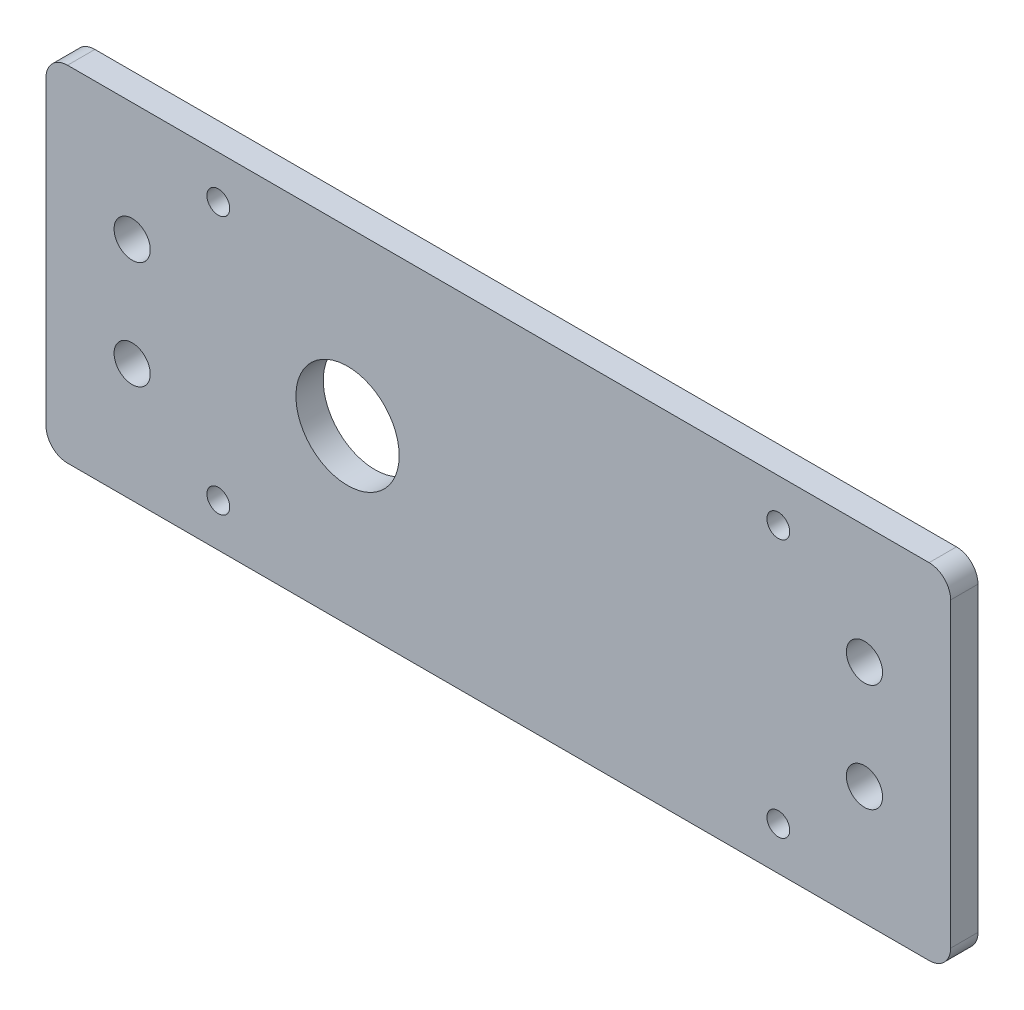
ISO-10303-21;
HEADER;
FILE_DESCRIPTION(('STEP AP214'),'2;1');
FILE_NAME('part.step','',(''),(''),'','','');
FILE_SCHEMA(('AUTOMOTIVE_DESIGN { 1 0 10303 214 1 1 1 1 }'));
ENDSEC;
DATA;
#1=APPLICATION_CONTEXT('core data for automotive mechanical design processes');
#2=APPLICATION_PROTOCOL_DEFINITION('international standard','automotive_design',2000,#1);
#3=PRODUCT_CONTEXT('',#1,'mechanical');
#4=PRODUCT('Part','Part','',(#3));
#5=PRODUCT_RELATED_PRODUCT_CATEGORY('part','',(#4));
#6=PRODUCT_DEFINITION_FORMATION('','',#4);
#7=PRODUCT_DEFINITION_CONTEXT('part definition',#1,'design');
#8=PRODUCT_DEFINITION('design','',#6,#7);
#9=PRODUCT_DEFINITION_SHAPE('','',#8);
#10=(LENGTH_UNIT() NAMED_UNIT(*) SI_UNIT(.MILLI.,.METRE.));
#11=(NAMED_UNIT(*) PLANE_ANGLE_UNIT() SI_UNIT($,.RADIAN.));
#12=(NAMED_UNIT(*) SI_UNIT($,.STERADIAN.) SOLID_ANGLE_UNIT());
#13=UNCERTAINTY_MEASURE_WITH_UNIT(LENGTH_MEASURE(1.E-05),#10,'distance_accuracy_value','');
#14=(GEOMETRIC_REPRESENTATION_CONTEXT(3) GLOBAL_UNCERTAINTY_ASSIGNED_CONTEXT((#13)) GLOBAL_UNIT_ASSIGNED_CONTEXT((#10,
#11,#12)) REPRESENTATION_CONTEXT('',''));
#15=CARTESIAN_POINT('',(0.,0.,0.));
#16=DIRECTION('',(0.,0.,1.));
#17=DIRECTION('',(1.,0.,0.));
#18=AXIS2_PLACEMENT_3D('',#15,#16,#17);
#19=CARTESIAN_POINT('',(-70.,40.,-6.35));
#20=DIRECTION('',(-1.,0.,0.));
#21=DIRECTION('',(0.,0.,1.));
#22=AXIS2_PLACEMENT_3D('',#19,#20,#21);
#23=PLANE('',#22);
#24=DIRECTION('',(0.,-1.,0.));
#25=VECTOR('',#24,1.);
#26=CARTESIAN_POINT('',(-70.,40.,-6.35));
#27=LINE('',#26,#25);
#28=CARTESIAN_POINT('',(-70.,35.,-6.35));
#29=VERTEX_POINT('',#28);
#30=CARTESIAN_POINT('',(-70.,-35.,-6.35));
#31=VERTEX_POINT('',#30);
#32=EDGE_CURVE('E158',#29,#31,#27,.T.);
#33=ORIENTED_EDGE('',*,*,#32,.T.);
#34=DIRECTION('',(0.,0.,1.));
#35=VECTOR('',#34,1.);
#36=CARTESIAN_POINT('',(-70.,-35.,-6.35));
#37=LINE('',#36,#35);
#38=CARTESIAN_POINT('',(-70.,-35.,0.));
#39=VERTEX_POINT('',#38);
#40=EDGE_CURVE('E11',#31,#39,#37,.T.);
#41=ORIENTED_EDGE('',*,*,#40,.T.);
#42=DIRECTION('',(0.,-1.,0.));
#43=VECTOR('',#42,1.);
#44=CARTESIAN_POINT('',(-70.,40.,0.));
#45=LINE('',#44,#43);
#46=CARTESIAN_POINT('',(-70.,35.,0.));
#47=VERTEX_POINT('',#46);
#48=EDGE_CURVE('E108',#47,#39,#45,.T.);
#49=ORIENTED_EDGE('',*,*,#48,.F.);
#50=DIRECTION('',(0.,0.,1.));
#51=VECTOR('',#50,1.);
#52=CARTESIAN_POINT('',(-70.,35.,-6.35));
#53=LINE('',#52,#51);
#54=EDGE_CURVE('E44',#47,#29,#53,.F.);
#55=ORIENTED_EDGE('',*,*,#54,.T.);
#56=EDGE_LOOP('',(#33,#41,#49,#55));
#57=FACE_BOUND('',#56,.T.);
#58=ADVANCED_FACE('F36',(#57),#23,.T.);
#59=CARTESIAN_POINT('',(-70.,40.,-6.35));
#60=DIRECTION('',(0.,1.,0.));
#61=DIRECTION('',(0.,0.,1.));
#62=AXIS2_PLACEMENT_3D('',#59,#60,#61);
#63=PLANE('',#62);
#64=DIRECTION('',(-1.,0.,0.));
#65=VECTOR('',#64,1.);
#66=CARTESIAN_POINT('',(-70.,40.,0.));
#67=LINE('',#66,#65);
#68=CARTESIAN_POINT('',(135.,40.,0.));
#69=VERTEX_POINT('',#68);
#70=CARTESIAN_POINT('',(-65.,40.,0.));
#71=VERTEX_POINT('',#70);
#72=EDGE_CURVE('E134',#69,#71,#67,.T.);
#73=ORIENTED_EDGE('',*,*,#72,.F.);
#74=DIRECTION('',(0.,0.,1.));
#75=VECTOR('',#74,1.);
#76=CARTESIAN_POINT('',(135.,40.,-6.35));
#77=LINE('',#76,#75);
#78=CARTESIAN_POINT('',(135.,40.,-6.35));
#79=VERTEX_POINT('',#78);
#80=EDGE_CURVE('E58',#69,#79,#77,.F.);
#81=ORIENTED_EDGE('',*,*,#80,.T.);
#82=DIRECTION('',(-1.,0.,0.));
#83=VECTOR('',#82,1.);
#84=CARTESIAN_POINT('',(-70.,40.,-6.35));
#85=LINE('',#84,#83);
#86=CARTESIAN_POINT('',(-65.,40.,-6.35));
#87=VERTEX_POINT('',#86);
#88=EDGE_CURVE('E128',#79,#87,#85,.T.);
#89=ORIENTED_EDGE('',*,*,#88,.T.);
#90=DIRECTION('',(0.,0.,1.));
#91=VECTOR('',#90,1.);
#92=CARTESIAN_POINT('',(-65.,40.,-6.35));
#93=LINE('',#92,#91);
#94=EDGE_CURVE('E152',#87,#71,#93,.T.);
#95=ORIENTED_EDGE('',*,*,#94,.T.);
#96=EDGE_LOOP('',(#73,#81,#89,#95));
#97=FACE_BOUND('',#96,.T.);
#98=ADVANCED_FACE('F166',(#97),#63,.T.);
#99=CARTESIAN_POINT('',(140.,40.,-6.35));
#100=DIRECTION('',(1.,0.,0.));
#101=DIRECTION('',(0.,0.,-1.));
#102=AXIS2_PLACEMENT_3D('',#99,#100,#101);
#103=PLANE('',#102);
#104=DIRECTION('',(0.,1.,0.));
#105=VECTOR('',#104,1.);
#106=CARTESIAN_POINT('',(140.,40.,0.));
#107=LINE('',#106,#105);
#108=CARTESIAN_POINT('',(140.,-35.,0.));
#109=VERTEX_POINT('',#108);
#110=CARTESIAN_POINT('',(140.,35.,0.));
#111=VERTEX_POINT('',#110);
#112=EDGE_CURVE('E123',#109,#111,#107,.T.);
#113=ORIENTED_EDGE('',*,*,#112,.F.);
#114=DIRECTION('',(0.,0.,1.));
#115=VECTOR('',#114,1.);
#116=CARTESIAN_POINT('',(140.,-35.,-6.35));
#117=LINE('',#116,#115);
#118=CARTESIAN_POINT('',(140.,-35.,-6.35));
#119=VERTEX_POINT('',#118);
#120=EDGE_CURVE('E144',#109,#119,#117,.F.);
#121=ORIENTED_EDGE('',*,*,#120,.T.);
#122=DIRECTION('',(0.,1.,0.));
#123=VECTOR('',#122,1.);
#124=CARTESIAN_POINT('',(140.,40.,-6.35));
#125=LINE('',#124,#123);
#126=CARTESIAN_POINT('',(140.,35.,-6.35));
#127=VERTEX_POINT('',#126);
#128=EDGE_CURVE('E131',#119,#127,#125,.T.);
#129=ORIENTED_EDGE('',*,*,#128,.T.);
#130=DIRECTION('',(0.,0.,1.));
#131=VECTOR('',#130,1.);
#132=CARTESIAN_POINT('',(140.,35.,-6.35));
#133=LINE('',#132,#131);
#134=EDGE_CURVE('E141',#127,#111,#133,.T.);
#135=ORIENTED_EDGE('',*,*,#134,.T.);
#136=EDGE_LOOP('',(#113,#121,#129,#135));
#137=FACE_BOUND('',#136,.T.);
#138=ADVANCED_FACE('F268',(#137),#103,.T.);
#139=CARTESIAN_POINT('',(-70.,-40.,-6.35));
#140=DIRECTION('',(0.,-1.,0.));
#141=DIRECTION('',(0.,0.,-1.));
#142=AXIS2_PLACEMENT_3D('',#139,#140,#141);
#143=PLANE('',#142);
#144=DIRECTION('',(1.,0.,0.));
#145=VECTOR('',#144,1.);
#146=CARTESIAN_POINT('',(-70.,-40.,-6.35));
#147=LINE('',#146,#145);
#148=CARTESIAN_POINT('',(-65.,-40.,-6.35));
#149=VERTEX_POINT('',#148);
#150=CARTESIAN_POINT('',(135.,-40.,-6.35));
#151=VERTEX_POINT('',#150);
#152=EDGE_CURVE('E162',#149,#151,#147,.T.);
#153=ORIENTED_EDGE('',*,*,#152,.T.);
#154=DIRECTION('',(0.,0.,1.));
#155=VECTOR('',#154,1.);
#156=CARTESIAN_POINT('',(135.,-40.,-6.35));
#157=LINE('',#156,#155);
#158=CARTESIAN_POINT('',(135.,-40.,0.));
#159=VERTEX_POINT('',#158);
#160=EDGE_CURVE('E122',#151,#159,#157,.T.);
#161=ORIENTED_EDGE('',*,*,#160,.T.);
#162=DIRECTION('',(1.,0.,0.));
#163=VECTOR('',#162,1.);
#164=CARTESIAN_POINT('',(-70.,-40.,0.));
#165=LINE('',#164,#163);
#166=CARTESIAN_POINT('',(-65.,-40.,0.));
#167=VERTEX_POINT('',#166);
#168=EDGE_CURVE('E106',#167,#159,#165,.T.);
#169=ORIENTED_EDGE('',*,*,#168,.F.);
#170=DIRECTION('',(0.,0.,1.));
#171=VECTOR('',#170,1.);
#172=CARTESIAN_POINT('',(-65.,-40.,-6.35));
#173=LINE('',#172,#171);
#174=EDGE_CURVE('E119',#167,#149,#173,.F.);
#175=ORIENTED_EDGE('',*,*,#174,.T.);
#176=EDGE_LOOP('',(#153,#161,#169,#175));
#177=FACE_BOUND('',#176,.T.);
#178=ADVANCED_FACE('F118',(#177),#143,.T.);
#179=CARTESIAN_POINT('',(0.,0.,-6.35));
#180=DIRECTION('',(0.,0.,1.));
#181=DIRECTION('',(1.,0.,0.));
#182=AXIS2_PLACEMENT_3D('',#179,#180,#181);
#183=PLANE('',#182);
#184=CARTESIAN_POINT('',(-50.,12.5,-6.35));
#185=DIRECTION('',(0.,0.,1.));
#186=DIRECTION('',(1.,0.,0.));
#187=AXIS2_PLACEMENT_3D('',#184,#185,#186);
#188=CIRCLE('',#187,4.2);
#189=CARTESIAN_POINT('',(-45.8,12.5,-6.35));
#190=VERTEX_POINT('',#189);
#191=EDGE_CURVE('E222',#190,#190,#188,.T.);
#192=ORIENTED_EDGE('',*,*,#191,.T.);
#193=EDGE_LOOP('',(#192));
#194=FACE_BOUND('',#193,.T.);
#195=CARTESIAN_POINT('',(-50.,-12.5,-6.35));
#196=DIRECTION('',(0.,0.,1.));
#197=DIRECTION('',(1.,0.,0.));
#198=AXIS2_PLACEMENT_3D('',#195,#196,#197);
#199=CIRCLE('',#198,4.2);
#200=CARTESIAN_POINT('',(-45.8,-12.5,-6.35));
#201=VERTEX_POINT('',#200);
#202=EDGE_CURVE('E216',#201,#201,#199,.T.);
#203=ORIENTED_EDGE('',*,*,#202,.T.);
#204=EDGE_LOOP('',(#203));
#205=FACE_BOUND('',#204,.T.);
#206=CARTESIAN_POINT('',(120.,-12.5,-6.35));
#207=DIRECTION('',(0.,0.,1.));
#208=DIRECTION('',(1.,0.,0.));
#209=AXIS2_PLACEMENT_3D('',#206,#207,#208);
#210=CIRCLE('',#209,4.2);
#211=CARTESIAN_POINT('',(124.2,-12.5,-6.35));
#212=VERTEX_POINT('',#211);
#213=EDGE_CURVE('E210',#212,#212,#210,.T.);
#214=ORIENTED_EDGE('',*,*,#213,.T.);
#215=EDGE_LOOP('',(#214));
#216=FACE_BOUND('',#215,.T.);
#217=CARTESIAN_POINT('',(120.,12.5,-6.35));
#218=DIRECTION('',(0.,0.,1.));
#219=DIRECTION('',(1.,0.,0.));
#220=AXIS2_PLACEMENT_3D('',#217,#218,#219);
#221=CIRCLE('',#220,4.2);
#222=CARTESIAN_POINT('',(124.2,12.5,-6.35));
#223=VERTEX_POINT('',#222);
#224=EDGE_CURVE('E204',#223,#223,#221,.T.);
#225=ORIENTED_EDGE('',*,*,#224,.T.);
#226=EDGE_LOOP('',(#225));
#227=FACE_BOUND('',#226,.T.);
#228=CARTESIAN_POINT('',(-30.,30.,-6.35));
#229=DIRECTION('',(0.,0.,1.));
#230=DIRECTION('',(1.,0.,0.));
#231=AXIS2_PLACEMENT_3D('',#228,#229,#230);
#232=CIRCLE('',#231,2.65);
#233=CARTESIAN_POINT('',(-27.35,30.,-6.35));
#234=VERTEX_POINT('',#233);
#235=EDGE_CURVE('E198',#234,#234,#232,.T.);
#236=ORIENTED_EDGE('',*,*,#235,.T.);
#237=EDGE_LOOP('',(#236));
#238=FACE_BOUND('',#237,.T.);
#239=CARTESIAN_POINT('',(-30.,-30.,-6.35));
#240=DIRECTION('',(0.,0.,1.));
#241=DIRECTION('',(1.,0.,0.));
#242=AXIS2_PLACEMENT_3D('',#239,#240,#241);
#243=CIRCLE('',#242,2.65);
#244=CARTESIAN_POINT('',(-27.35,-30.,-6.35));
#245=VERTEX_POINT('',#244);
#246=EDGE_CURVE('E192',#245,#245,#243,.T.);
#247=ORIENTED_EDGE('',*,*,#246,.T.);
#248=EDGE_LOOP('',(#247));
#249=FACE_BOUND('',#248,.T.);
#250=CARTESIAN_POINT('',(100.,-30.,-6.35));
#251=DIRECTION('',(0.,0.,1.));
#252=DIRECTION('',(1.,0.,0.));
#253=AXIS2_PLACEMENT_3D('',#250,#251,#252);
#254=CIRCLE('',#253,2.65);
#255=CARTESIAN_POINT('',(102.65,-30.,-6.35));
#256=VERTEX_POINT('',#255);
#257=EDGE_CURVE('E186',#256,#256,#254,.T.);
#258=ORIENTED_EDGE('',*,*,#257,.T.);
#259=EDGE_LOOP('',(#258));
#260=FACE_BOUND('',#259,.T.);
#261=CARTESIAN_POINT('',(100.,30.,-6.35));
#262=DIRECTION('',(0.,0.,1.));
#263=DIRECTION('',(1.,0.,0.));
#264=AXIS2_PLACEMENT_3D('',#261,#262,#263);
#265=CIRCLE('',#264,2.65);
#266=CARTESIAN_POINT('',(102.65,30.,-6.35));
#267=VERTEX_POINT('',#266);
#268=EDGE_CURVE('E178',#267,#267,#265,.T.);
#269=ORIENTED_EDGE('',*,*,#268,.T.);
#270=EDGE_LOOP('',(#269));
#271=FACE_BOUND('',#270,.T.);
#272=CARTESIAN_POINT('',(0.,0.,-6.35));
#273=DIRECTION('',(0.,0.,1.));
#274=DIRECTION('',(1.,0.,0.));
#275=AXIS2_PLACEMENT_3D('',#272,#273,#274);
#276=CIRCLE('',#275,11.9875);
#277=CARTESIAN_POINT('',(11.9875,0.,-6.35));
#278=VERTEX_POINT('',#277);
#279=EDGE_CURVE('E170',#278,#278,#276,.T.);
#280=ORIENTED_EDGE('',*,*,#279,.T.);
#281=EDGE_LOOP('',(#280));
#282=FACE_BOUND('',#281,.T.);
#283=ORIENTED_EDGE('',*,*,#128,.F.);
#284=CARTESIAN_POINT('',(135.,-35.,-6.35));
#285=DIRECTION('',(0.,0.,1.));
#286=DIRECTION('',(1.,0.,0.));
#287=AXIS2_PLACEMENT_3D('',#284,#285,#286);
#288=CIRCLE('',#287,5.);
#289=EDGE_CURVE('E150',#119,#151,#288,.F.);
#290=ORIENTED_EDGE('',*,*,#289,.T.);
#291=ORIENTED_EDGE('',*,*,#152,.F.);
#292=CARTESIAN_POINT('',(-65.,-35.,-6.35));
#293=DIRECTION('',(0.,0.,1.));
#294=DIRECTION('',(1.,0.,0.));
#295=AXIS2_PLACEMENT_3D('',#292,#293,#294);
#296=CIRCLE('',#295,5.);
#297=EDGE_CURVE('E127',#149,#31,#296,.F.);
#298=ORIENTED_EDGE('',*,*,#297,.T.);
#299=ORIENTED_EDGE('',*,*,#32,.F.);
#300=CARTESIAN_POINT('',(-65.,35.,-6.35));
#301=DIRECTION('',(0.,0.,1.));
#302=DIRECTION('',(1.,0.,0.));
#303=AXIS2_PLACEMENT_3D('',#300,#301,#302);
#304=CIRCLE('',#303,5.);
#305=EDGE_CURVE('E51',#29,#87,#304,.F.);
#306=ORIENTED_EDGE('',*,*,#305,.T.);
#307=ORIENTED_EDGE('',*,*,#88,.F.);
#308=CARTESIAN_POINT('',(135.,35.,-6.35));
#309=DIRECTION('',(0.,0.,1.));
#310=DIRECTION('',(1.,0.,0.));
#311=AXIS2_PLACEMENT_3D('',#308,#309,#310);
#312=CIRCLE('',#311,5.);
#313=EDGE_CURVE('E148',#79,#127,#312,.F.);
#314=ORIENTED_EDGE('',*,*,#313,.T.);
#315=EDGE_LOOP('',(#283,#290,#291,#298,#299,#306,#307,#314));
#316=FACE_BOUND('',#315,.T.);
#317=ADVANCED_FACE('F161',(#194,#205,#216,#227,#238,#249,#260,#271,#282,#316),#183,.F.);
#318=CARTESIAN_POINT('',(0.,0.,0.));
#319=DIRECTION('',(0.,0.,1.));
#320=DIRECTION('',(1.,0.,0.));
#321=AXIS2_PLACEMENT_3D('',#318,#319,#320);
#322=PLANE('',#321);
#323=CARTESIAN_POINT('',(-50.,12.5,0.));
#324=DIRECTION('',(0.,0.,1.));
#325=DIRECTION('',(1.,0.,0.));
#326=AXIS2_PLACEMENT_3D('',#323,#324,#325);
#327=CIRCLE('',#326,4.2);
#328=CARTESIAN_POINT('',(-45.8,12.5,0.));
#329=VERTEX_POINT('',#328);
#330=EDGE_CURVE('E225',#329,#329,#327,.T.);
#331=ORIENTED_EDGE('',*,*,#330,.F.);
#332=EDGE_LOOP('',(#331));
#333=FACE_BOUND('',#332,.T.);
#334=CARTESIAN_POINT('',(-50.,-12.5,0.));
#335=DIRECTION('',(0.,0.,1.));
#336=DIRECTION('',(1.,0.,0.));
#337=AXIS2_PLACEMENT_3D('',#334,#335,#336);
#338=CIRCLE('',#337,4.2);
#339=CARTESIAN_POINT('',(-45.8,-12.5,0.));
#340=VERTEX_POINT('',#339);
#341=EDGE_CURVE('E219',#340,#340,#338,.T.);
#342=ORIENTED_EDGE('',*,*,#341,.F.);
#343=EDGE_LOOP('',(#342));
#344=FACE_BOUND('',#343,.T.);
#345=CARTESIAN_POINT('',(120.,-12.5,0.));
#346=DIRECTION('',(0.,0.,1.));
#347=DIRECTION('',(1.,0.,0.));
#348=AXIS2_PLACEMENT_3D('',#345,#346,#347);
#349=CIRCLE('',#348,4.2);
#350=CARTESIAN_POINT('',(124.2,-12.5,0.));
#351=VERTEX_POINT('',#350);
#352=EDGE_CURVE('E213',#351,#351,#349,.T.);
#353=ORIENTED_EDGE('',*,*,#352,.F.);
#354=EDGE_LOOP('',(#353));
#355=FACE_BOUND('',#354,.T.);
#356=CARTESIAN_POINT('',(120.,12.5,0.));
#357=DIRECTION('',(0.,0.,1.));
#358=DIRECTION('',(1.,0.,0.));
#359=AXIS2_PLACEMENT_3D('',#356,#357,#358);
#360=CIRCLE('',#359,4.2);
#361=CARTESIAN_POINT('',(124.2,12.5,0.));
#362=VERTEX_POINT('',#361);
#363=EDGE_CURVE('E207',#362,#362,#360,.T.);
#364=ORIENTED_EDGE('',*,*,#363,.F.);
#365=EDGE_LOOP('',(#364));
#366=FACE_BOUND('',#365,.T.);
#367=CARTESIAN_POINT('',(-30.,30.,0.));
#368=DIRECTION('',(0.,0.,1.));
#369=DIRECTION('',(1.,0.,0.));
#370=AXIS2_PLACEMENT_3D('',#367,#368,#369);
#371=CIRCLE('',#370,2.65);
#372=CARTESIAN_POINT('',(-27.35,30.,0.));
#373=VERTEX_POINT('',#372);
#374=EDGE_CURVE('E201',#373,#373,#371,.T.);
#375=ORIENTED_EDGE('',*,*,#374,.F.);
#376=EDGE_LOOP('',(#375));
#377=FACE_BOUND('',#376,.T.);
#378=CARTESIAN_POINT('',(-30.,-30.,0.));
#379=DIRECTION('',(0.,0.,1.));
#380=DIRECTION('',(1.,0.,0.));
#381=AXIS2_PLACEMENT_3D('',#378,#379,#380);
#382=CIRCLE('',#381,2.65);
#383=CARTESIAN_POINT('',(-27.35,-30.,0.));
#384=VERTEX_POINT('',#383);
#385=EDGE_CURVE('E195',#384,#384,#382,.T.);
#386=ORIENTED_EDGE('',*,*,#385,.F.);
#387=EDGE_LOOP('',(#386));
#388=FACE_BOUND('',#387,.T.);
#389=CARTESIAN_POINT('',(100.,-30.,0.));
#390=DIRECTION('',(0.,0.,1.));
#391=DIRECTION('',(1.,0.,0.));
#392=AXIS2_PLACEMENT_3D('',#389,#390,#391);
#393=CIRCLE('',#392,2.65);
#394=CARTESIAN_POINT('',(102.65,-30.,0.));
#395=VERTEX_POINT('',#394);
#396=EDGE_CURVE('E189',#395,#395,#393,.T.);
#397=ORIENTED_EDGE('',*,*,#396,.F.);
#398=EDGE_LOOP('',(#397));
#399=FACE_BOUND('',#398,.T.);
#400=CARTESIAN_POINT('',(100.,30.,0.));
#401=DIRECTION('',(0.,0.,1.));
#402=DIRECTION('',(1.,0.,0.));
#403=AXIS2_PLACEMENT_3D('',#400,#401,#402);
#404=CIRCLE('',#403,2.65);
#405=CARTESIAN_POINT('',(102.65,30.,0.));
#406=VERTEX_POINT('',#405);
#407=EDGE_CURVE('E183',#406,#406,#404,.T.);
#408=ORIENTED_EDGE('',*,*,#407,.F.);
#409=EDGE_LOOP('',(#408));
#410=FACE_BOUND('',#409,.T.);
#411=CARTESIAN_POINT('',(0.,0.,0.));
#412=DIRECTION('',(0.,0.,1.));
#413=DIRECTION('',(1.,0.,0.));
#414=AXIS2_PLACEMENT_3D('',#411,#412,#413);
#415=CIRCLE('',#414,11.9875);
#416=CARTESIAN_POINT('',(11.9875,0.,0.));
#417=VERTEX_POINT('',#416);
#418=EDGE_CURVE('E175',#417,#417,#415,.T.);
#419=ORIENTED_EDGE('',*,*,#418,.F.);
#420=EDGE_LOOP('',(#419));
#421=FACE_BOUND('',#420,.T.);
#422=ORIENTED_EDGE('',*,*,#168,.T.);
#423=CARTESIAN_POINT('',(135.,-35.,0.));
#424=DIRECTION('',(0.,0.,1.));
#425=DIRECTION('',(1.,0.,0.));
#426=AXIS2_PLACEMENT_3D('',#423,#424,#425);
#427=CIRCLE('',#426,5.);
#428=EDGE_CURVE('E139',#159,#109,#427,.T.);
#429=ORIENTED_EDGE('',*,*,#428,.T.);
#430=ORIENTED_EDGE('',*,*,#112,.T.);
#431=CARTESIAN_POINT('',(135.,35.,0.));
#432=DIRECTION('',(0.,0.,1.));
#433=DIRECTION('',(1.,0.,0.));
#434=AXIS2_PLACEMENT_3D('',#431,#432,#433);
#435=CIRCLE('',#434,5.);
#436=EDGE_CURVE('E112',#111,#69,#435,.T.);
#437=ORIENTED_EDGE('',*,*,#436,.T.);
#438=ORIENTED_EDGE('',*,*,#72,.T.);
#439=CARTESIAN_POINT('',(-65.,35.,0.));
#440=DIRECTION('',(0.,0.,1.));
#441=DIRECTION('',(1.,0.,0.));
#442=AXIS2_PLACEMENT_3D('',#439,#440,#441);
#443=CIRCLE('',#442,5.);
#444=EDGE_CURVE('E113',#71,#47,#443,.T.);
#445=ORIENTED_EDGE('',*,*,#444,.T.);
#446=ORIENTED_EDGE('',*,*,#48,.T.);
#447=CARTESIAN_POINT('',(-65.,-35.,0.));
#448=DIRECTION('',(0.,0.,1.));
#449=DIRECTION('',(1.,0.,0.));
#450=AXIS2_PLACEMENT_3D('',#447,#448,#449);
#451=CIRCLE('',#450,5.);
#452=EDGE_CURVE('E103',#39,#167,#451,.T.);
#453=ORIENTED_EDGE('',*,*,#452,.T.);
#454=EDGE_LOOP('',(#422,#429,#430,#437,#438,#445,#446,#453));
#455=FACE_BOUND('',#454,.T.);
#456=ADVANCED_FACE('F105',(#333,#344,#355,#366,#377,#388,#399,#410,#421,#455),#322,.T.);
#457=CARTESIAN_POINT('',(0.,0.,-6.35));
#458=DIRECTION('',(0.,0.,1.));
#459=DIRECTION('',(1.,0.,0.));
#460=AXIS2_PLACEMENT_3D('',#457,#458,#459);
#461=CYLINDRICAL_SURFACE('',#460,11.9875);
#462=ORIENTED_EDGE('',*,*,#279,.F.);
#463=EDGE_LOOP('',(#462));
#464=FACE_BOUND('',#463,.T.);
#465=ORIENTED_EDGE('',*,*,#418,.T.);
#466=EDGE_LOOP('',(#465));
#467=FACE_BOUND('',#466,.T.);
#468=ADVANCED_FACE('F233',(#464,#467),#461,.F.);
#469=CARTESIAN_POINT('',(100.,30.,0.));
#470=DIRECTION('',(0.,0.,1.));
#471=DIRECTION('',(1.,0.,0.));
#472=AXIS2_PLACEMENT_3D('',#469,#470,#471);
#473=CYLINDRICAL_SURFACE('',#472,2.65);
#474=ORIENTED_EDGE('',*,*,#268,.F.);
#475=EDGE_LOOP('',(#474));
#476=FACE_BOUND('',#475,.T.);
#477=ORIENTED_EDGE('',*,*,#407,.T.);
#478=EDGE_LOOP('',(#477));
#479=FACE_BOUND('',#478,.T.);
#480=ADVANCED_FACE('F252',(#476,#479),#473,.F.);
#481=CARTESIAN_POINT('',(100.,-30.,0.));
#482=DIRECTION('',(0.,0.,1.));
#483=DIRECTION('',(1.,0.,0.));
#484=AXIS2_PLACEMENT_3D('',#481,#482,#483);
#485=CYLINDRICAL_SURFACE('',#484,2.65);
#486=ORIENTED_EDGE('',*,*,#257,.F.);
#487=EDGE_LOOP('',(#486));
#488=FACE_BOUND('',#487,.T.);
#489=ORIENTED_EDGE('',*,*,#396,.T.);
#490=EDGE_LOOP('',(#489));
#491=FACE_BOUND('',#490,.T.);
#492=ADVANCED_FACE('F258',(#488,#491),#485,.F.);
#493=CARTESIAN_POINT('',(-30.,-30.,0.));
#494=DIRECTION('',(0.,0.,1.));
#495=DIRECTION('',(1.,0.,0.));
#496=AXIS2_PLACEMENT_3D('',#493,#494,#495);
#497=CYLINDRICAL_SURFACE('',#496,2.65);
#498=ORIENTED_EDGE('',*,*,#246,.F.);
#499=EDGE_LOOP('',(#498));
#500=FACE_BOUND('',#499,.T.);
#501=ORIENTED_EDGE('',*,*,#385,.T.);
#502=EDGE_LOOP('',(#501));
#503=FACE_BOUND('',#502,.T.);
#504=ADVANCED_FACE('F304',(#500,#503),#497,.F.);
#505=CARTESIAN_POINT('',(-30.,30.,0.));
#506=DIRECTION('',(0.,0.,1.));
#507=DIRECTION('',(1.,0.,0.));
#508=AXIS2_PLACEMENT_3D('',#505,#506,#507);
#509=CYLINDRICAL_SURFACE('',#508,2.65);
#510=ORIENTED_EDGE('',*,*,#235,.F.);
#511=EDGE_LOOP('',(#510));
#512=FACE_BOUND('',#511,.T.);
#513=ORIENTED_EDGE('',*,*,#374,.T.);
#514=EDGE_LOOP('',(#513));
#515=FACE_BOUND('',#514,.T.);
#516=ADVANCED_FACE('F277',(#512,#515),#509,.F.);
#517=CARTESIAN_POINT('',(135.,-35.,-6.35));
#518=DIRECTION('',(0.,0.,1.));
#519=DIRECTION('',(1.,0.,0.));
#520=AXIS2_PLACEMENT_3D('',#517,#518,#519);
#521=CYLINDRICAL_SURFACE('',#520,5.);
#522=ORIENTED_EDGE('',*,*,#289,.F.);
#523=ORIENTED_EDGE('',*,*,#120,.F.);
#524=ORIENTED_EDGE('',*,*,#428,.F.);
#525=ORIENTED_EDGE('',*,*,#160,.F.);
#526=EDGE_LOOP('',(#522,#523,#524,#525));
#527=FACE_BOUND('',#526,.T.);
#528=ADVANCED_FACE('F273',(#527),#521,.T.);
#529=CARTESIAN_POINT('',(135.,35.,-6.35));
#530=DIRECTION('',(0.,0.,1.));
#531=DIRECTION('',(1.,0.,0.));
#532=AXIS2_PLACEMENT_3D('',#529,#530,#531);
#533=CYLINDRICAL_SURFACE('',#532,5.);
#534=ORIENTED_EDGE('',*,*,#313,.F.);
#535=ORIENTED_EDGE('',*,*,#80,.F.);
#536=ORIENTED_EDGE('',*,*,#436,.F.);
#537=ORIENTED_EDGE('',*,*,#134,.F.);
#538=EDGE_LOOP('',(#534,#535,#536,#537));
#539=FACE_BOUND('',#538,.T.);
#540=ADVANCED_FACE('F276',(#539),#533,.T.);
#541=CARTESIAN_POINT('',(-65.,-35.,-6.35));
#542=DIRECTION('',(0.,0.,1.));
#543=DIRECTION('',(1.,0.,0.));
#544=AXIS2_PLACEMENT_3D('',#541,#542,#543);
#545=CYLINDRICAL_SURFACE('',#544,5.);
#546=ORIENTED_EDGE('',*,*,#297,.F.);
#547=ORIENTED_EDGE('',*,*,#174,.F.);
#548=ORIENTED_EDGE('',*,*,#452,.F.);
#549=ORIENTED_EDGE('',*,*,#40,.F.);
#550=EDGE_LOOP('',(#546,#547,#548,#549));
#551=FACE_BOUND('',#550,.T.);
#552=ADVANCED_FACE('F126',(#551),#545,.T.);
#553=CARTESIAN_POINT('',(-65.,35.,-6.35));
#554=DIRECTION('',(0.,0.,1.));
#555=DIRECTION('',(1.,0.,0.));
#556=AXIS2_PLACEMENT_3D('',#553,#554,#555);
#557=CYLINDRICAL_SURFACE('',#556,5.);
#558=ORIENTED_EDGE('',*,*,#305,.F.);
#559=ORIENTED_EDGE('',*,*,#54,.F.);
#560=ORIENTED_EDGE('',*,*,#444,.F.);
#561=ORIENTED_EDGE('',*,*,#94,.F.);
#562=EDGE_LOOP('',(#558,#559,#560,#561));
#563=FACE_BOUND('',#562,.T.);
#564=ADVANCED_FACE('F38',(#563),#557,.T.);
#565=CARTESIAN_POINT('',(120.,12.5,0.));
#566=DIRECTION('',(0.,0.,1.));
#567=DIRECTION('',(1.,0.,0.));
#568=AXIS2_PLACEMENT_3D('',#565,#566,#567);
#569=CYLINDRICAL_SURFACE('',#568,4.2);
#570=ORIENTED_EDGE('',*,*,#224,.F.);
#571=EDGE_LOOP('',(#570));
#572=FACE_BOUND('',#571,.T.);
#573=ORIENTED_EDGE('',*,*,#363,.T.);
#574=EDGE_LOOP('',(#573));
#575=FACE_BOUND('',#574,.T.);
#576=ADVANCED_FACE('F285',(#572,#575),#569,.F.);
#577=CARTESIAN_POINT('',(120.,-12.5,0.));
#578=DIRECTION('',(0.,0.,1.));
#579=DIRECTION('',(1.,0.,0.));
#580=AXIS2_PLACEMENT_3D('',#577,#578,#579);
#581=CYLINDRICAL_SURFACE('',#580,4.2);
#582=ORIENTED_EDGE('',*,*,#213,.F.);
#583=EDGE_LOOP('',(#582));
#584=FACE_BOUND('',#583,.T.);
#585=ORIENTED_EDGE('',*,*,#352,.T.);
#586=EDGE_LOOP('',(#585));
#587=FACE_BOUND('',#586,.T.);
#588=ADVANCED_FACE('F289',(#584,#587),#581,.F.);
#589=CARTESIAN_POINT('',(-50.,-12.5,0.));
#590=DIRECTION('',(0.,0.,1.));
#591=DIRECTION('',(1.,0.,0.));
#592=AXIS2_PLACEMENT_3D('',#589,#590,#591);
#593=CYLINDRICAL_SURFACE('',#592,4.2);
#594=ORIENTED_EDGE('',*,*,#202,.F.);
#595=EDGE_LOOP('',(#594));
#596=FACE_BOUND('',#595,.T.);
#597=ORIENTED_EDGE('',*,*,#341,.T.);
#598=EDGE_LOOP('',(#597));
#599=FACE_BOUND('',#598,.T.);
#600=ADVANCED_FACE('F295',(#596,#599),#593,.F.);
#601=CARTESIAN_POINT('',(-50.,12.5,0.));
#602=DIRECTION('',(0.,0.,1.));
#603=DIRECTION('',(1.,0.,0.));
#604=AXIS2_PLACEMENT_3D('',#601,#602,#603);
#605=CYLINDRICAL_SURFACE('',#604,4.2);
#606=ORIENTED_EDGE('',*,*,#191,.F.);
#607=EDGE_LOOP('',(#606));
#608=FACE_BOUND('',#607,.T.);
#609=ORIENTED_EDGE('',*,*,#330,.T.);
#610=EDGE_LOOP('',(#609));
#611=FACE_BOUND('',#610,.T.);
#612=ADVANCED_FACE('F229',(#608,#611),#605,.F.);
#613=CLOSED_SHELL('',(#58,#98,#138,#178,#317,#456,#468,#480,#492,#504,#516,#528,#540,#552,#564,
#576,#588,#600,#612));
#614=MANIFOLD_SOLID_BREP('B2',#613);
#615=ADVANCED_BREP_SHAPE_REPRESENTATION('',(#18,#614),#14);
#616=SHAPE_DEFINITION_REPRESENTATION(#9,#615);
ENDSEC;
END-ISO-10303-21;
